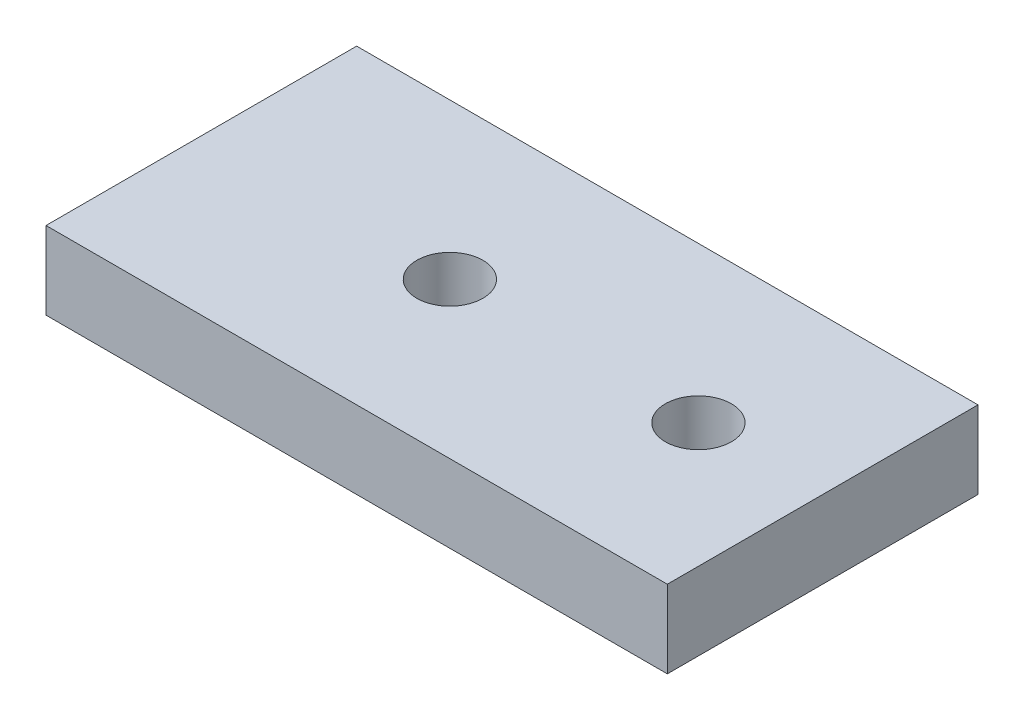
ISO-10303-21;
HEADER;
FILE_DESCRIPTION(('STEP AP214'),'2;1');
FILE_NAME('part.step','',(''),(''),'','','');
FILE_SCHEMA(('AUTOMOTIVE_DESIGN { 1 0 10303 214 1 1 1 1 }'));
ENDSEC;
DATA;
#1=APPLICATION_CONTEXT('core data for automotive mechanical design processes');
#2=APPLICATION_PROTOCOL_DEFINITION('international standard','automotive_design',2000,#1);
#3=PRODUCT_CONTEXT('',#1,'mechanical');
#4=PRODUCT('Part','Part','',(#3));
#5=PRODUCT_RELATED_PRODUCT_CATEGORY('part','',(#4));
#6=PRODUCT_DEFINITION_FORMATION('','',#4);
#7=PRODUCT_DEFINITION_CONTEXT('part definition',#1,'design');
#8=PRODUCT_DEFINITION('design','',#6,#7);
#9=PRODUCT_DEFINITION_SHAPE('','',#8);
#10=(LENGTH_UNIT() NAMED_UNIT(*) SI_UNIT(.MILLI.,.METRE.));
#11=(NAMED_UNIT(*) PLANE_ANGLE_UNIT() SI_UNIT($,.RADIAN.));
#12=(NAMED_UNIT(*) SI_UNIT($,.STERADIAN.) SOLID_ANGLE_UNIT());
#13=UNCERTAINTY_MEASURE_WITH_UNIT(LENGTH_MEASURE(1.E-05),#10,'distance_accuracy_value','');
#14=(GEOMETRIC_REPRESENTATION_CONTEXT(3) GLOBAL_UNCERTAINTY_ASSIGNED_CONTEXT((#13)) GLOBAL_UNIT_ASSIGNED_CONTEXT((#10,
#11,#12)) REPRESENTATION_CONTEXT('',''));
#15=CARTESIAN_POINT('',(0.,0.,0.));
#16=DIRECTION('',(0.,0.,1.));
#17=DIRECTION('',(1.,0.,0.));
#18=AXIS2_PLACEMENT_3D('',#15,#16,#17);
#19=CARTESIAN_POINT('',(0.,5.,0.));
#20=DIRECTION('',(0.,-1.,0.));
#21=DIRECTION('',(0.,0.,-1.));
#22=AXIS2_PLACEMENT_3D('',#19,#20,#21);
#23=PLANE('',#22);
#24=DIRECTION('',(0.,0.,-1.));
#25=VECTOR('',#24,1.);
#26=CARTESIAN_POINT('',(20.,5.,10.));
#27=LINE('',#26,#25);
#28=CARTESIAN_POINT('',(20.,5.,10.));
#29=VERTEX_POINT('',#28);
#30=CARTESIAN_POINT('',(20.,5.,-10.));
#31=VERTEX_POINT('',#30);
#32=EDGE_CURVE('E93',#29,#31,#27,.T.);
#33=ORIENTED_EDGE('',*,*,#32,.T.);
#34=DIRECTION('',(-1.,0.,0.));
#35=VECTOR('',#34,1.);
#36=CARTESIAN_POINT('',(-20.,5.,-10.));
#37=LINE('',#36,#35);
#38=CARTESIAN_POINT('',(-20.,5.,-10.));
#39=VERTEX_POINT('',#38);
#40=EDGE_CURVE('E88',#31,#39,#37,.T.);
#41=ORIENTED_EDGE('',*,*,#40,.T.);
#42=DIRECTION('',(0.,0.,1.));
#43=VECTOR('',#42,1.);
#44=CARTESIAN_POINT('',(-20.,5.,10.));
#45=LINE('',#44,#43);
#46=CARTESIAN_POINT('',(-20.,5.,10.));
#47=VERTEX_POINT('',#46);
#48=EDGE_CURVE('E91',#39,#47,#45,.T.);
#49=ORIENTED_EDGE('',*,*,#48,.T.);
#50=DIRECTION('',(1.,0.,0.));
#51=VECTOR('',#50,1.);
#52=CARTESIAN_POINT('',(-20.,5.,10.));
#53=LINE('',#52,#51);
#54=EDGE_CURVE('E58',#47,#29,#53,.T.);
#55=ORIENTED_EDGE('',*,*,#54,.T.);
#56=EDGE_LOOP('',(#33,#41,#49,#55));
#57=FACE_BOUND('',#56,.T.);
#58=CARTESIAN_POINT('',(12.,5.,0.));
#59=DIRECTION('',(0.,1.,0.));
#60=DIRECTION('',(0.,0.,1.));
#61=AXIS2_PLACEMENT_3D('',#58,#59,#60);
#62=CIRCLE('',#61,2.125);
#63=CARTESIAN_POINT('',(12.,5.,2.125));
#64=VERTEX_POINT('',#63);
#65=EDGE_CURVE('E108',#64,#64,#62,.T.);
#66=ORIENTED_EDGE('',*,*,#65,.F.);
#67=EDGE_LOOP('',(#66));
#68=FACE_BOUND('',#67,.T.);
#69=CARTESIAN_POINT('',(-4.,5.,0.));
#70=DIRECTION('',(0.,1.,0.));
#71=DIRECTION('',(0.,0.,1.));
#72=AXIS2_PLACEMENT_3D('',#69,#70,#71);
#73=CIRCLE('',#72,2.125);
#74=CARTESIAN_POINT('',(-4.,5.,2.125));
#75=VERTEX_POINT('',#74);
#76=EDGE_CURVE('E123',#75,#75,#73,.T.);
#77=ORIENTED_EDGE('',*,*,#76,.F.);
#78=EDGE_LOOP('',(#77));
#79=FACE_BOUND('',#78,.T.);
#80=ADVANCED_FACE('F41',(#57,#68,#79),#23,.F.);
#81=CARTESIAN_POINT('',(0.,0.,0.));
#82=DIRECTION('',(0.,-1.,0.));
#83=DIRECTION('',(0.,0.,-1.));
#84=AXIS2_PLACEMENT_3D('',#81,#82,#83);
#85=PLANE('',#84);
#86=CARTESIAN_POINT('',(12.,0.,0.));
#87=DIRECTION('',(0.,1.,0.));
#88=DIRECTION('',(0.,0.,1.));
#89=AXIS2_PLACEMENT_3D('',#86,#87,#88);
#90=CIRCLE('',#89,2.125);
#91=CARTESIAN_POINT('',(12.,0.,2.125));
#92=VERTEX_POINT('',#91);
#93=EDGE_CURVE('E120',#92,#92,#90,.T.);
#94=ORIENTED_EDGE('',*,*,#93,.T.);
#95=EDGE_LOOP('',(#94));
#96=FACE_BOUND('',#95,.T.);
#97=DIRECTION('',(0.,0.,-1.));
#98=VECTOR('',#97,1.);
#99=CARTESIAN_POINT('',(20.,0.,10.));
#100=LINE('',#99,#98);
#101=CARTESIAN_POINT('',(20.,0.,10.));
#102=VERTEX_POINT('',#101);
#103=CARTESIAN_POINT('',(20.,0.,-10.));
#104=VERTEX_POINT('',#103);
#105=EDGE_CURVE('E105',#102,#104,#100,.T.);
#106=ORIENTED_EDGE('',*,*,#105,.F.);
#107=DIRECTION('',(1.,0.,0.));
#108=VECTOR('',#107,1.);
#109=CARTESIAN_POINT('',(-20.,0.,10.));
#110=LINE('',#109,#108);
#111=CARTESIAN_POINT('',(-20.,0.,10.));
#112=VERTEX_POINT('',#111);
#113=EDGE_CURVE('E81',#112,#102,#110,.T.);
#114=ORIENTED_EDGE('',*,*,#113,.F.);
#115=DIRECTION('',(0.,0.,1.));
#116=VECTOR('',#115,1.);
#117=CARTESIAN_POINT('',(-20.,0.,10.));
#118=LINE('',#117,#116);
#119=CARTESIAN_POINT('',(-20.,0.,-10.));
#120=VERTEX_POINT('',#119);
#121=EDGE_CURVE('E75',#120,#112,#118,.T.);
#122=ORIENTED_EDGE('',*,*,#121,.F.);
#123=DIRECTION('',(-1.,0.,0.));
#124=VECTOR('',#123,1.);
#125=CARTESIAN_POINT('',(-20.,0.,-10.));
#126=LINE('',#125,#124);
#127=EDGE_CURVE('E97',#104,#120,#126,.T.);
#128=ORIENTED_EDGE('',*,*,#127,.F.);
#129=EDGE_LOOP('',(#106,#114,#122,#128));
#130=FACE_BOUND('',#129,.T.);
#131=CARTESIAN_POINT('',(-4.,0.,0.));
#132=DIRECTION('',(0.,1.,0.));
#133=DIRECTION('',(0.,0.,1.));
#134=AXIS2_PLACEMENT_3D('',#131,#132,#133);
#135=CIRCLE('',#134,2.125);
#136=CARTESIAN_POINT('',(-4.,0.,2.125));
#137=VERTEX_POINT('',#136);
#138=EDGE_CURVE('E126',#137,#137,#135,.T.);
#139=ORIENTED_EDGE('',*,*,#138,.T.);
#140=EDGE_LOOP('',(#139));
#141=FACE_BOUND('',#140,.T.);
#142=ADVANCED_FACE('F116',(#96,#130,#141),#85,.T.);
#143=CARTESIAN_POINT('',(20.,5.,10.));
#144=DIRECTION('',(-1.,0.,0.));
#145=DIRECTION('',(0.,0.,1.));
#146=AXIS2_PLACEMENT_3D('',#143,#144,#145);
#147=PLANE('',#146);
#148=ORIENTED_EDGE('',*,*,#105,.T.);
#149=DIRECTION('',(0.,-1.,0.));
#150=VECTOR('',#149,1.);
#151=CARTESIAN_POINT('',(20.,5.,-10.));
#152=LINE('',#151,#150);
#153=EDGE_CURVE('E11',#31,#104,#152,.T.);
#154=ORIENTED_EDGE('',*,*,#153,.F.);
#155=ORIENTED_EDGE('',*,*,#32,.F.);
#156=DIRECTION('',(0.,-1.,0.));
#157=VECTOR('',#156,1.);
#158=CARTESIAN_POINT('',(20.,5.,10.));
#159=LINE('',#158,#157);
#160=EDGE_CURVE('E101',#29,#102,#159,.T.);
#161=ORIENTED_EDGE('',*,*,#160,.T.);
#162=EDGE_LOOP('',(#148,#154,#155,#161));
#163=FACE_BOUND('',#162,.T.);
#164=ADVANCED_FACE('F43',(#163),#147,.F.);
#165=CARTESIAN_POINT('',(-20.,5.,-10.));
#166=DIRECTION('',(0.,0.,1.));
#167=DIRECTION('',(1.,0.,0.));
#168=AXIS2_PLACEMENT_3D('',#165,#166,#167);
#169=PLANE('',#168);
#170=ORIENTED_EDGE('',*,*,#127,.T.);
#171=DIRECTION('',(0.,-1.,0.));
#172=VECTOR('',#171,1.);
#173=CARTESIAN_POINT('',(-20.,5.,-10.));
#174=LINE('',#173,#172);
#175=EDGE_CURVE('E50',#39,#120,#174,.T.);
#176=ORIENTED_EDGE('',*,*,#175,.F.);
#177=ORIENTED_EDGE('',*,*,#40,.F.);
#178=ORIENTED_EDGE('',*,*,#153,.T.);
#179=EDGE_LOOP('',(#170,#176,#177,#178));
#180=FACE_BOUND('',#179,.T.);
#181=ADVANCED_FACE('F96',(#180),#169,.F.);
#182=CARTESIAN_POINT('',(-20.,5.,10.));
#183=DIRECTION('',(1.,0.,0.));
#184=DIRECTION('',(0.,0.,-1.));
#185=AXIS2_PLACEMENT_3D('',#182,#183,#184);
#186=PLANE('',#185);
#187=ORIENTED_EDGE('',*,*,#121,.T.);
#188=DIRECTION('',(0.,-1.,0.));
#189=VECTOR('',#188,1.);
#190=CARTESIAN_POINT('',(-20.,5.,10.));
#191=LINE('',#190,#189);
#192=EDGE_CURVE('E98',#47,#112,#191,.T.);
#193=ORIENTED_EDGE('',*,*,#192,.F.);
#194=ORIENTED_EDGE('',*,*,#48,.F.);
#195=ORIENTED_EDGE('',*,*,#175,.T.);
#196=EDGE_LOOP('',(#187,#193,#194,#195));
#197=FACE_BOUND('',#196,.T.);
#198=ADVANCED_FACE('F99',(#197),#186,.F.);
#199=CARTESIAN_POINT('',(-20.,5.,10.));
#200=DIRECTION('',(0.,0.,-1.));
#201=DIRECTION('',(-1.,0.,0.));
#202=AXIS2_PLACEMENT_3D('',#199,#200,#201);
#203=PLANE('',#202);
#204=ORIENTED_EDGE('',*,*,#113,.T.);
#205=ORIENTED_EDGE('',*,*,#160,.F.);
#206=ORIENTED_EDGE('',*,*,#54,.F.);
#207=ORIENTED_EDGE('',*,*,#192,.T.);
#208=EDGE_LOOP('',(#204,#205,#206,#207));
#209=FACE_BOUND('',#208,.T.);
#210=ADVANCED_FACE('F113',(#209),#203,.F.);
#211=CARTESIAN_POINT('',(12.,5.,0.));
#212=DIRECTION('',(0.,-1.,0.));
#213=DIRECTION('',(0.,0.,-1.));
#214=AXIS2_PLACEMENT_3D('',#211,#212,#213);
#215=CYLINDRICAL_SURFACE('',#214,2.125);
#216=ORIENTED_EDGE('',*,*,#65,.T.);
#217=EDGE_LOOP('',(#216));
#218=FACE_BOUND('',#217,.T.);
#219=ORIENTED_EDGE('',*,*,#93,.F.);
#220=EDGE_LOOP('',(#219));
#221=FACE_BOUND('',#220,.T.);
#222=ADVANCED_FACE('F143',(#218,#221),#215,.F.);
#223=CARTESIAN_POINT('',(-4.,5.,0.));
#224=DIRECTION('',(0.,-1.,0.));
#225=DIRECTION('',(0.,0.,-1.));
#226=AXIS2_PLACEMENT_3D('',#223,#224,#225);
#227=CYLINDRICAL_SURFACE('',#226,2.125);
#228=ORIENTED_EDGE('',*,*,#76,.T.);
#229=EDGE_LOOP('',(#228));
#230=FACE_BOUND('',#229,.T.);
#231=ORIENTED_EDGE('',*,*,#138,.F.);
#232=EDGE_LOOP('',(#231));
#233=FACE_BOUND('',#232,.T.);
#234=ADVANCED_FACE('F132',(#230,#233),#227,.F.);
#235=CLOSED_SHELL('',(#80,#142,#164,#181,#198,#210,#222,#234));
#236=MANIFOLD_SOLID_BREP('B2',#235);
#237=ADVANCED_BREP_SHAPE_REPRESENTATION('',(#18,#236),#14);
#238=SHAPE_DEFINITION_REPRESENTATION(#9,#237);
ENDSEC;
END-ISO-10303-21;
